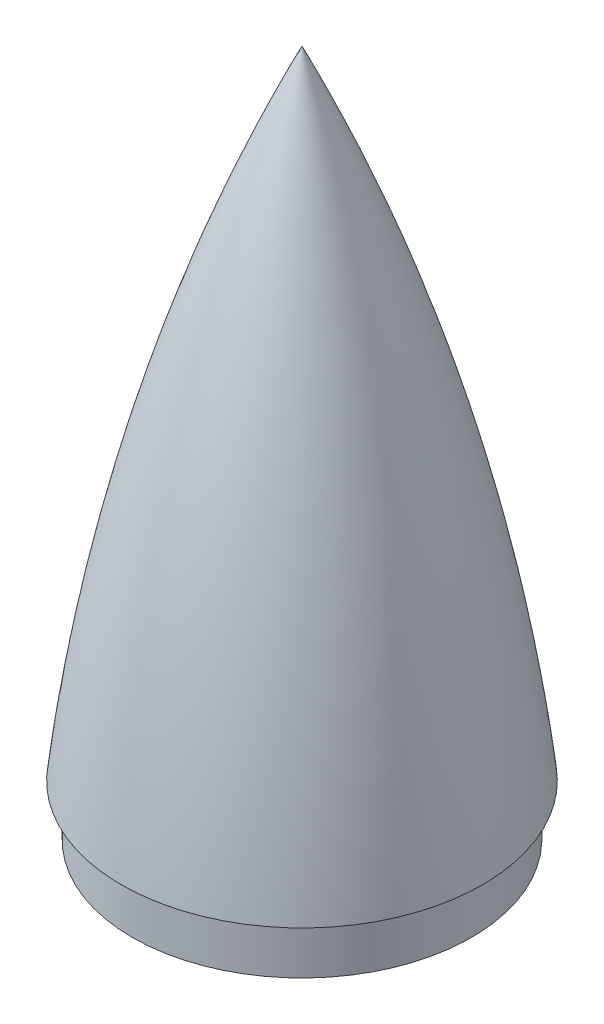
ISO-10303-21;
HEADER;
FILE_DESCRIPTION(('STEP AP214'),'2;1');
FILE_NAME('part.step','',(''),(''),'','','');
FILE_SCHEMA(('AUTOMOTIVE_DESIGN { 1 0 10303 214 1 1 1 1 }'));
ENDSEC;
DATA;
#1=APPLICATION_CONTEXT('core data for automotive mechanical design processes');
#2=APPLICATION_PROTOCOL_DEFINITION('international standard','automotive_design',2000,#1);
#3=PRODUCT_CONTEXT('',#1,'mechanical');
#4=PRODUCT('Part','Part','',(#3));
#5=PRODUCT_RELATED_PRODUCT_CATEGORY('part','',(#4));
#6=PRODUCT_DEFINITION_FORMATION('','',#4);
#7=PRODUCT_DEFINITION_CONTEXT('part definition',#1,'design');
#8=PRODUCT_DEFINITION('design','',#6,#7);
#9=PRODUCT_DEFINITION_SHAPE('','',#8);
#10=(LENGTH_UNIT() NAMED_UNIT(*) SI_UNIT(.MILLI.,.METRE.));
#11=(NAMED_UNIT(*) PLANE_ANGLE_UNIT() SI_UNIT($,.RADIAN.));
#12=(NAMED_UNIT(*) SI_UNIT($,.STERADIAN.) SOLID_ANGLE_UNIT());
#13=UNCERTAINTY_MEASURE_WITH_UNIT(LENGTH_MEASURE(1.E-05),#10,'distance_accuracy_value','');
#14=(GEOMETRIC_REPRESENTATION_CONTEXT(3) GLOBAL_UNCERTAINTY_ASSIGNED_CONTEXT((#13)) GLOBAL_UNIT_ASSIGNED_CONTEXT((#10,
#11,#12)) REPRESENTATION_CONTEXT('',''));
#15=CARTESIAN_POINT('',(0.,0.,0.));
#16=DIRECTION('',(0.,0.,1.));
#17=DIRECTION('',(1.,0.,0.));
#18=AXIS2_PLACEMENT_3D('',#15,#16,#17);
#19=CARTESIAN_POINT('',(0.,103.234638665826,0.));
#20=DIRECTION('',(0.,-1.,0.));
#21=DIRECTION('',(0.,0.,-1.));
#22=AXIS2_PLACEMENT_3D('',#19,#20,#21);
#23=PLANE('',#22);
#24=CARTESIAN_POINT('',(0.,103.234638665826,0.));
#25=DIRECTION('',(0.,-1.,0.));
#26=DIRECTION('',(0.,0.,-1.));
#27=AXIS2_PLACEMENT_3D('',#24,#25,#26);
#28=CIRCLE('',#27,53.0193248656348);
#29=CARTESIAN_POINT('',(0.,103.234638665826,-53.0193248656348));
#30=VERTEX_POINT('',#29);
#31=EDGE_CURVE('E11',#30,#30,#28,.F.);
#32=ORIENTED_EDGE('',*,*,#31,.F.);
#33=EDGE_LOOP('',(#32));
#34=FACE_BOUND('',#33,.T.);
#35=CARTESIAN_POINT('',(0.,103.234638665826,0.));
#36=DIRECTION('',(0.,-1.,0.));
#37=DIRECTION('',(0.,0.,-1.));
#38=AXIS2_PLACEMENT_3D('',#35,#36,#37);
#39=CIRCLE('',#38,49.8);
#40=CARTESIAN_POINT('',(0.,103.234638665826,-49.8));
#41=VERTEX_POINT('',#40);
#42=EDGE_CURVE('E63',#41,#41,#39,.T.);
#43=ORIENTED_EDGE('',*,*,#42,.F.);
#44=EDGE_LOOP('',(#43));
#45=FACE_BOUND('',#44,.T.);
#46=ADVANCED_FACE('F39',(#34,#45),#23,.T.);
#47=CARTESIAN_POINT('',(0.,36.1164471617856,538.869158618901));
#48=DIRECTION('',(-1.,0.,0.));
#49=DIRECTION('',(0.,0.,-1.));
#50=AXIS2_PLACEMENT_3D('',#47,#48,#49);
#51=CIRCLE('',#50,595.681818181818);
#52=TRIMMED_CURVE('',#51,(PARAMETER_VALUE(-0.440295334739211)),
(PARAMETER_VALUE(0.440295334739211)),.T.,.PARAMETER.);
#53=CARTESIAN_POINT('',(0.,36.1164471617856,0.));
#54=DIRECTION('',(0.,-1.,0.));
#55=AXIS1_PLACEMENT('',#53,#54);
#56=SURFACE_OF_REVOLUTION('',#52,#55);
#57=CARTESIAN_POINT('',(0.,290.,0.));
#58=VERTEX_POINT('',#57);
#59=VERTEX_LOOP('',#58);
#60=FACE_BOUND('',#59,.T.);
#61=ORIENTED_EDGE('',*,*,#31,.T.);
#62=EDGE_LOOP('',(#61));
#63=FACE_BOUND('',#62,.T.);
#64=ADVANCED_FACE('F41',(#60,#63),#56,.T.);
#65=CARTESIAN_POINT('',(0.,88.234638665826,0.));
#66=DIRECTION('',(0.,-1.,0.));
#67=DIRECTION('',(0.,0.,-1.));
#68=AXIS2_PLACEMENT_3D('',#65,#66,#67);
#69=PLANE('',#68);
#70=CARTESIAN_POINT('',(0.,88.234638665826,0.));
#71=DIRECTION('',(0.,-1.,0.));
#72=DIRECTION('',(0.,0.,-1.));
#73=AXIS2_PLACEMENT_3D('',#70,#71,#72);
#74=CIRCLE('',#73,49.8);
#75=CARTESIAN_POINT('',(0.,88.234638665826,-49.8));
#76=VERTEX_POINT('',#75);
#77=EDGE_CURVE('E65',#76,#76,#74,.T.);
#78=ORIENTED_EDGE('',*,*,#77,.T.);
#79=EDGE_LOOP('',(#78));
#80=FACE_BOUND('',#79,.T.);
#81=CARTESIAN_POINT('',(0.,88.234638665826,0.));
#82=DIRECTION('',(0.,-1.,0.));
#83=DIRECTION('',(0.,0.,-1.));
#84=AXIS2_PLACEMENT_3D('',#81,#82,#83);
#85=CIRCLE('',#84,47.);
#86=CARTESIAN_POINT('',(0.,88.234638665826,-47.));
#87=VERTEX_POINT('',#86);
#88=EDGE_CURVE('E66',#87,#87,#85,.T.);
#89=ORIENTED_EDGE('',*,*,#88,.F.);
#90=EDGE_LOOP('',(#89));
#91=FACE_BOUND('',#90,.T.);
#92=ADVANCED_FACE('F55',(#80,#91),#69,.T.);
#93=CARTESIAN_POINT('',(0.,88.234638665826,0.));
#94=DIRECTION('',(0.,1.,0.));
#95=DIRECTION('',(0.,0.,1.));
#96=AXIS2_PLACEMENT_3D('',#93,#94,#95);
#97=CYLINDRICAL_SURFACE('',#96,49.8);
#98=ORIENTED_EDGE('',*,*,#77,.F.);
#99=EDGE_LOOP('',(#98));
#100=FACE_BOUND('',#99,.T.);
#101=ORIENTED_EDGE('',*,*,#42,.T.);
#102=EDGE_LOOP('',(#101));
#103=FACE_BOUND('',#102,.T.);
#104=ADVANCED_FACE('F80',(#100,#103),#97,.T.);
#105=CARTESIAN_POINT('',(0.,36.1164471617856,538.869158618901));
#106=DIRECTION('',(-1.,0.,0.));
#107=DIRECTION('',(0.,0.,-1.));
#108=AXIS2_PLACEMENT_3D('',#105,#106,#107);
#109=CIRCLE('',#108,592.681818181818);
#110=TRIMMED_CURVE('',#109,(PARAMETER_VALUE(-0.429426182314728)),
(PARAMETER_VALUE(0.429426182314728)),.T.,.PARAMETER.);
#111=CARTESIAN_POINT('',(0.,36.1164471617856,0.));
#112=DIRECTION('',(0.,-1.,0.));
#113=AXIS1_PLACEMENT('',#111,#112);
#114=SURFACE_OF_REVOLUTION('',#110,#113);
#115=CARTESIAN_POINT('',(0.,282.879020281502,0.));
#116=VERTEX_POINT('',#115);
#117=VERTEX_LOOP('',#116);
#118=FACE_BOUND('',#117,.T.);
#119=CARTESIAN_POINT('',(0.,125.721506073024,0.));
#120=DIRECTION('',(0.,-1.,0.));
#121=DIRECTION('',(0.,0.,-1.));
#122=AXIS2_PLACEMENT_3D('',#119,#120,#121);
#123=CIRCLE('',#122,47.);
#124=CARTESIAN_POINT('',(0.,125.721506073024,-47.));
#125=VERTEX_POINT('',#124);
#126=EDGE_CURVE('E47',#125,#125,#123,.F.);
#127=ORIENTED_EDGE('',*,*,#126,.F.);
#128=EDGE_LOOP('',(#127));
#129=FACE_BOUND('',#128,.T.);
#130=ADVANCED_FACE('F78',(#118,#129),#114,.F.);
#131=CARTESIAN_POINT('',(0.,290.001,0.));
#132=DIRECTION('',(0.,-1.,0.));
#133=DIRECTION('',(0.,0.,-1.));
#134=AXIS2_PLACEMENT_3D('',#131,#132,#133);
#135=CYLINDRICAL_SURFACE('',#134,47.);
#136=ORIENTED_EDGE('',*,*,#126,.T.);
#137=EDGE_LOOP('',(#136));
#138=FACE_BOUND('',#137,.T.);
#139=ORIENTED_EDGE('',*,*,#88,.T.);
#140=EDGE_LOOP('',(#139));
#141=FACE_BOUND('',#140,.T.);
#142=ADVANCED_FACE('F75',(#138,#141),#135,.F.);
#143=CLOSED_SHELL('',(#46,#64,#92,#104,#130,#142));
#144=MANIFOLD_SOLID_BREP('B2',#143);
#145=ADVANCED_BREP_SHAPE_REPRESENTATION('',(#18,#144),#14);
#146=SHAPE_DEFINITION_REPRESENTATION(#9,#145);
ENDSEC;
END-ISO-10303-21;
